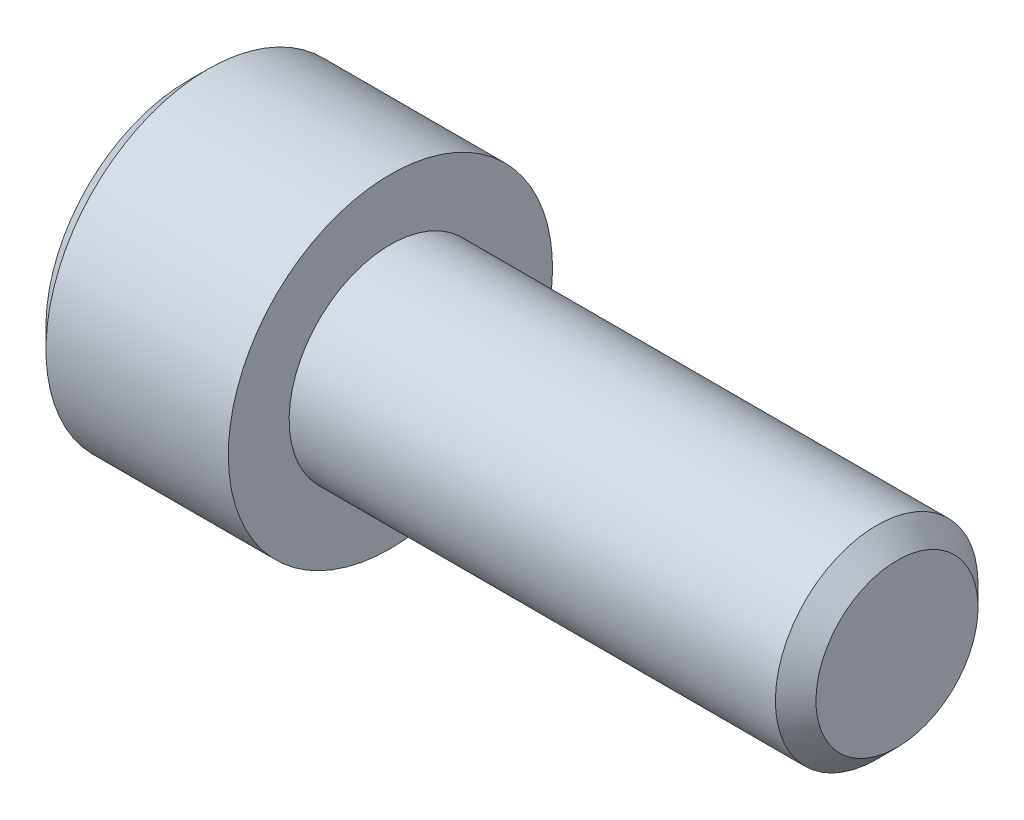
ISO-10303-21;
HEADER;
FILE_DESCRIPTION(('STEP AP214'),'2;1');
FILE_NAME('part.step','',(''),(''),'','','');
FILE_SCHEMA(('AUTOMOTIVE_DESIGN { 1 0 10303 214 1 1 1 1 }'));
ENDSEC;
DATA;
#1=APPLICATION_CONTEXT('core data for automotive mechanical design processes');
#2=APPLICATION_PROTOCOL_DEFINITION('international standard','automotive_design',2000,#1);
#3=PRODUCT_CONTEXT('',#1,'mechanical');
#4=PRODUCT('Part','Part','',(#3));
#5=PRODUCT_RELATED_PRODUCT_CATEGORY('part','',(#4));
#6=PRODUCT_DEFINITION_FORMATION('','',#4);
#7=PRODUCT_DEFINITION_CONTEXT('part definition',#1,'design');
#8=PRODUCT_DEFINITION('design','',#6,#7);
#9=PRODUCT_DEFINITION_SHAPE('','',#8);
#10=(LENGTH_UNIT() NAMED_UNIT(*) SI_UNIT(.MILLI.,.METRE.));
#11=(NAMED_UNIT(*) PLANE_ANGLE_UNIT() SI_UNIT($,.RADIAN.));
#12=(NAMED_UNIT(*) SI_UNIT($,.STERADIAN.) SOLID_ANGLE_UNIT());
#13=UNCERTAINTY_MEASURE_WITH_UNIT(LENGTH_MEASURE(1.E-05),#10,'distance_accuracy_value','');
#14=(GEOMETRIC_REPRESENTATION_CONTEXT(3) GLOBAL_UNCERTAINTY_ASSIGNED_CONTEXT((#13)) GLOBAL_UNIT_ASSIGNED_CONTEXT((#10,
#11,#12)) REPRESENTATION_CONTEXT('',''));
#15=CARTESIAN_POINT('',(0.,0.,0.));
#16=DIRECTION('',(0.,0.,1.));
#17=DIRECTION('',(1.,0.,0.));
#18=AXIS2_PLACEMENT_3D('',#15,#16,#17);
#19=CARTESIAN_POINT('',(-10.,0.,0.));
#20=DIRECTION('',(1.,0.,0.));
#21=DIRECTION('',(0.,1.,0.));
#22=AXIS2_PLACEMENT_3D('',#19,#20,#21);
#23=PLANE('',#22);
#24=CARTESIAN_POINT('',(-10.,0.,0.));
#25=DIRECTION('',(1.,0.,0.));
#26=DIRECTION('',(0.,1.,0.));
#27=AXIS2_PLACEMENT_3D('',#24,#25,#26);
#28=CIRCLE('',#27,7.);
#29=CARTESIAN_POINT('',(-10.,6.99999999999999,0.));
#30=VERTEX_POINT('',#29);
#31=EDGE_CURVE('E42',#30,#30,#28,.F.);
#32=ORIENTED_EDGE('',*,*,#31,.T.);
#33=EDGE_LOOP('',(#32));
#34=FACE_BOUND('',#33,.T.);
#35=DIRECTION('',(0.,0.5,0.866025403784439));
#36=VECTOR('',#35,1.);
#37=CARTESIAN_POINT('',(-10.,2.30940107675851,-4.));
#38=LINE('',#37,#36);
#39=CARTESIAN_POINT('',(-10.,2.30940107675851,-4.));
#40=VERTEX_POINT('',#39);
#41=CARTESIAN_POINT('',(-10.,4.61880215351701,0.));
#42=VERTEX_POINT('',#41);
#43=EDGE_CURVE('E49',#40,#42,#38,.T.);
#44=ORIENTED_EDGE('',*,*,#43,.T.);
#45=DIRECTION('',(0.,-0.5,0.866025403784438));
#46=VECTOR('',#45,1.);
#47=CARTESIAN_POINT('',(-10.,4.61880215351701,0.));
#48=LINE('',#47,#46);
#49=CARTESIAN_POINT('',(-10.,2.3094010767585,4.));
#50=VERTEX_POINT('',#49);
#51=EDGE_CURVE('E107',#42,#50,#48,.T.);
#52=ORIENTED_EDGE('',*,*,#51,.T.);
#53=DIRECTION('',(0.,-1.,0.));
#54=VECTOR('',#53,1.);
#55=CARTESIAN_POINT('',(-10.,2.3094010767585,4.));
#56=LINE('',#55,#54);
#57=CARTESIAN_POINT('',(-10.,-2.3094010767585,4.));
#58=VERTEX_POINT('',#57);
#59=EDGE_CURVE('E291',#50,#58,#56,.T.);
#60=ORIENTED_EDGE('',*,*,#59,.T.);
#61=DIRECTION('',(0.,-0.5,-0.866025403784439));
#62=VECTOR('',#61,1.);
#63=CARTESIAN_POINT('',(-10.,-2.3094010767585,4.));
#64=LINE('',#63,#62);
#65=CARTESIAN_POINT('',(-10.,-4.61880215351701,0.));
#66=VERTEX_POINT('',#65);
#67=EDGE_CURVE('E288',#58,#66,#64,.T.);
#68=ORIENTED_EDGE('',*,*,#67,.T.);
#69=DIRECTION('',(0.,0.5,-0.866025403784439));
#70=VECTOR('',#69,1.);
#71=CARTESIAN_POINT('',(-10.,-4.61880215351701,0.));
#72=LINE('',#71,#70);
#73=CARTESIAN_POINT('',(-10.,-2.3094010767585,-4.));
#74=VERTEX_POINT('',#73);
#75=EDGE_CURVE('E282',#66,#74,#72,.T.);
#76=ORIENTED_EDGE('',*,*,#75,.T.);
#77=DIRECTION('',(0.,1.,0.));
#78=VECTOR('',#77,1.);
#79=CARTESIAN_POINT('',(-10.,-2.3094010767585,-4.));
#80=LINE('',#79,#78);
#81=EDGE_CURVE('E103',#74,#40,#80,.T.);
#82=ORIENTED_EDGE('',*,*,#81,.T.);
#83=EDGE_LOOP('',(#44,#52,#60,#68,#76,#82));
#84=FACE_BOUND('',#83,.T.);
#85=ADVANCED_FACE('F34',(#34,#84),#23,.F.);
#86=CARTESIAN_POINT('',(25.,0.,0.));
#87=DIRECTION('',(-1.,0.,0.));
#88=DIRECTION('',(0.,-1.,0.));
#89=AXIS2_PLACEMENT_3D('',#86,#87,#88);
#90=CYLINDRICAL_SURFACE('',#89,8.);
#91=CARTESIAN_POINT('',(-8.99999999999998,0.,0.));
#92=DIRECTION('',(1.,0.,0.));
#93=DIRECTION('',(0.,1.,0.));
#94=AXIS2_PLACEMENT_3D('',#91,#92,#93);
#95=CIRCLE('',#94,8.);
#96=CARTESIAN_POINT('',(-8.99999999999998,7.99999999999999,0.));
#97=VERTEX_POINT('',#96);
#98=EDGE_CURVE('E11',#97,#97,#95,.T.);
#99=ORIENTED_EDGE('',*,*,#98,.T.);
#100=EDGE_LOOP('',(#99));
#101=FACE_BOUND('',#100,.T.);
#102=CARTESIAN_POINT('',(0.,0.,0.));
#103=DIRECTION('',(-1.,0.,0.));
#104=DIRECTION('',(0.,-1.,0.));
#105=AXIS2_PLACEMENT_3D('',#102,#103,#104);
#106=CIRCLE('',#105,8.);
#107=CARTESIAN_POINT('',(0.,-8.,0.));
#108=VERTEX_POINT('',#107);
#109=EDGE_CURVE('E120',#108,#108,#106,.T.);
#110=ORIENTED_EDGE('',*,*,#109,.T.);
#111=EDGE_LOOP('',(#110));
#112=FACE_BOUND('',#111,.T.);
#113=ADVANCED_FACE('F143',(#101,#112),#90,.T.);
#114=CARTESIAN_POINT('',(0.,7.99999999999999,0.));
#115=DIRECTION('',(-1.,0.,0.));
#116=DIRECTION('',(0.,-1.,0.));
#117=AXIS2_PLACEMENT_3D('',#114,#115,#116);
#118=PLANE('',#117);
#119=ORIENTED_EDGE('',*,*,#109,.F.);
#120=EDGE_LOOP('',(#119));
#121=FACE_BOUND('',#120,.T.);
#122=CARTESIAN_POINT('',(0.,0.,0.));
#123=DIRECTION('',(-1.,0.,0.));
#124=DIRECTION('',(0.,-1.,0.));
#125=AXIS2_PLACEMENT_3D('',#122,#123,#124);
#126=CIRCLE('',#125,5.);
#127=CARTESIAN_POINT('',(0.,-5.,0.));
#128=VERTEX_POINT('',#127);
#129=EDGE_CURVE('E112',#128,#128,#126,.T.);
#130=ORIENTED_EDGE('',*,*,#129,.T.);
#131=EDGE_LOOP('',(#130));
#132=FACE_BOUND('',#131,.T.);
#133=ADVANCED_FACE('F148',(#121,#132),#118,.F.);
#134=CARTESIAN_POINT('',(25.,0.,0.));
#135=DIRECTION('',(-1.,0.,0.));
#136=DIRECTION('',(0.,-1.,0.));
#137=AXIS2_PLACEMENT_3D('',#134,#135,#136);
#138=CYLINDRICAL_SURFACE('',#137,5.);
#139=CARTESIAN_POINT('',(24.,0.,0.));
#140=DIRECTION('',(-1.,0.,0.));
#141=DIRECTION('',(0.,-1.,0.));
#142=AXIS2_PLACEMENT_3D('',#139,#140,#141);
#143=CIRCLE('',#142,5.);
#144=CARTESIAN_POINT('',(24.,-5.,0.));
#145=VERTEX_POINT('',#144);
#146=EDGE_CURVE('E123',#145,#145,#143,.T.);
#147=ORIENTED_EDGE('',*,*,#146,.T.);
#148=EDGE_LOOP('',(#147));
#149=FACE_BOUND('',#148,.T.);
#150=ORIENTED_EDGE('',*,*,#129,.F.);
#151=EDGE_LOOP('',(#150));
#152=FACE_BOUND('',#151,.T.);
#153=ADVANCED_FACE('F154',(#149,#152),#138,.T.);
#154=CARTESIAN_POINT('',(25.,5.,0.));
#155=DIRECTION('',(-1.,0.,0.));
#156=DIRECTION('',(0.,-1.,0.));
#157=AXIS2_PLACEMENT_3D('',#154,#155,#156);
#158=PLANE('',#157);
#159=CARTESIAN_POINT('',(25.,0.,0.));
#160=DIRECTION('',(-1.,0.,0.));
#161=DIRECTION('',(0.,-1.,0.));
#162=AXIS2_PLACEMENT_3D('',#159,#160,#161);
#163=CIRCLE('',#162,3.99999999999999);
#164=CARTESIAN_POINT('',(25.,-3.99999999999999,0.));
#165=VERTEX_POINT('',#164);
#166=EDGE_CURVE('E126',#165,#165,#163,.F.);
#167=ORIENTED_EDGE('',*,*,#166,.T.);
#168=EDGE_LOOP('',(#167));
#169=FACE_BOUND('',#168,.T.);
#170=ADVANCED_FACE('F158',(#169),#158,.F.);
#171=CARTESIAN_POINT('',(-5.,2.30940107675851,-4.));
#172=DIRECTION('',(0.,-0.866025403784439,0.5));
#173=DIRECTION('',(0.,-0.5,-0.866025403784439));
#174=AXIS2_PLACEMENT_3D('',#171,#172,#173);
#175=PLANE('',#174);
#176=ORIENTED_EDGE('',*,*,#43,.F.);
#177=DIRECTION('',(-1.,0.,0.));
#178=VECTOR('',#177,1.);
#179=CARTESIAN_POINT('',(-5.,2.30940107675851,-4.));
#180=LINE('',#179,#178);
#181=CARTESIAN_POINT('',(-5.,2.30940107675851,-4.));
#182=VERTEX_POINT('',#181);
#183=EDGE_CURVE('E102',#182,#40,#180,.T.);
#184=ORIENTED_EDGE('',*,*,#183,.F.);
#185=DIRECTION('',(0.,0.5,0.866025403784439));
#186=VECTOR('',#185,1.);
#187=CARTESIAN_POINT('',(-5.,2.30940107675851,-4.));
#188=LINE('',#187,#186);
#189=CARTESIAN_POINT('',(-5.,4.61880215351701,0.));
#190=VERTEX_POINT('',#189);
#191=EDGE_CURVE('E93',#182,#190,#188,.T.);
#192=ORIENTED_EDGE('',*,*,#191,.T.);
#193=DIRECTION('',(-1.,0.,0.));
#194=VECTOR('',#193,1.);
#195=CARTESIAN_POINT('',(-5.,4.61880215351701,0.));
#196=LINE('',#195,#194);
#197=EDGE_CURVE('E101',#190,#42,#196,.T.);
#198=ORIENTED_EDGE('',*,*,#197,.T.);
#199=EDGE_LOOP('',(#176,#184,#192,#198));
#200=FACE_BOUND('',#199,.T.);
#201=ADVANCED_FACE('F100',(#200),#175,.T.);
#202=CARTESIAN_POINT('',(-5.,4.61880215351701,0.));
#203=DIRECTION('',(0.,-0.866025403784438,-0.5));
#204=DIRECTION('',(0.,0.5,-0.866025403784438));
#205=AXIS2_PLACEMENT_3D('',#202,#203,#204);
#206=PLANE('',#205);
#207=ORIENTED_EDGE('',*,*,#51,.F.);
#208=ORIENTED_EDGE('',*,*,#197,.F.);
#209=DIRECTION('',(0.,-0.5,0.866025403784438));
#210=VECTOR('',#209,1.);
#211=CARTESIAN_POINT('',(-5.,4.61880215351701,0.));
#212=LINE('',#211,#210);
#213=CARTESIAN_POINT('',(-5.,2.3094010767585,4.));
#214=VERTEX_POINT('',#213);
#215=EDGE_CURVE('E89',#190,#214,#212,.T.);
#216=ORIENTED_EDGE('',*,*,#215,.T.);
#217=DIRECTION('',(-1.,0.,0.));
#218=VECTOR('',#217,1.);
#219=CARTESIAN_POINT('',(-5.,2.3094010767585,4.));
#220=LINE('',#219,#218);
#221=EDGE_CURVE('E109',#214,#50,#220,.T.);
#222=ORIENTED_EDGE('',*,*,#221,.T.);
#223=EDGE_LOOP('',(#207,#208,#216,#222));
#224=FACE_BOUND('',#223,.T.);
#225=ADVANCED_FACE('F105',(#224),#206,.T.);
#226=CARTESIAN_POINT('',(-5.,2.3094010767585,4.));
#227=DIRECTION('',(0.,0.,-1.));
#228=DIRECTION('',(0.,1.,0.));
#229=AXIS2_PLACEMENT_3D('',#226,#227,#228);
#230=PLANE('',#229);
#231=ORIENTED_EDGE('',*,*,#59,.F.);
#232=ORIENTED_EDGE('',*,*,#221,.F.);
#233=DIRECTION('',(0.,-1.,0.));
#234=VECTOR('',#233,1.);
#235=CARTESIAN_POINT('',(-5.,2.3094010767585,4.));
#236=LINE('',#235,#234);
#237=CARTESIAN_POINT('',(-5.,-2.3094010767585,4.));
#238=VERTEX_POINT('',#237);
#239=EDGE_CURVE('E95',#214,#238,#236,.T.);
#240=ORIENTED_EDGE('',*,*,#239,.T.);
#241=DIRECTION('',(-1.,0.,0.));
#242=VECTOR('',#241,1.);
#243=CARTESIAN_POINT('',(-5.,-2.3094010767585,4.));
#244=LINE('',#243,#242);
#245=EDGE_CURVE('E114',#238,#58,#244,.T.);
#246=ORIENTED_EDGE('',*,*,#245,.T.);
#247=EDGE_LOOP('',(#231,#232,#240,#246));
#248=FACE_BOUND('',#247,.T.);
#249=ADVANCED_FACE('F170',(#248),#230,.T.);
#250=CARTESIAN_POINT('',(-5.,-2.3094010767585,4.));
#251=DIRECTION('',(0.,0.866025403784439,-0.5));
#252=DIRECTION('',(0.,0.5,0.866025403784439));
#253=AXIS2_PLACEMENT_3D('',#250,#251,#252);
#254=PLANE('',#253);
#255=ORIENTED_EDGE('',*,*,#67,.F.);
#256=ORIENTED_EDGE('',*,*,#245,.F.);
#257=DIRECTION('',(0.,-0.5,-0.866025403784439));
#258=VECTOR('',#257,1.);
#259=CARTESIAN_POINT('',(-5.,-2.3094010767585,4.));
#260=LINE('',#259,#258);
#261=CARTESIAN_POINT('',(-5.,-4.618802153517,0.));
#262=VERTEX_POINT('',#261);
#263=EDGE_CURVE('E307',#238,#262,#260,.T.);
#264=ORIENTED_EDGE('',*,*,#263,.T.);
#265=DIRECTION('',(-1.,0.,0.));
#266=VECTOR('',#265,1.);
#267=CARTESIAN_POINT('',(-5.,-4.618802153517,0.));
#268=LINE('',#267,#266);
#269=EDGE_CURVE('E298',#262,#66,#268,.T.);
#270=ORIENTED_EDGE('',*,*,#269,.T.);
#271=EDGE_LOOP('',(#255,#256,#264,#270));
#272=FACE_BOUND('',#271,.T.);
#273=ADVANCED_FACE('F173',(#272),#254,.T.);
#274=CARTESIAN_POINT('',(-5.,-4.618802153517,0.));
#275=DIRECTION('',(0.,0.866025403784439,0.5));
#276=DIRECTION('',(0.,-0.5,0.866025403784439));
#277=AXIS2_PLACEMENT_3D('',#274,#275,#276);
#278=PLANE('',#277);
#279=ORIENTED_EDGE('',*,*,#75,.F.);
#280=ORIENTED_EDGE('',*,*,#269,.F.);
#281=DIRECTION('',(0.,0.5,-0.866025403784439));
#282=VECTOR('',#281,1.);
#283=CARTESIAN_POINT('',(-5.,-4.618802153517,0.));
#284=LINE('',#283,#282);
#285=CARTESIAN_POINT('',(-5.,-2.3094010767585,-4.));
#286=VERTEX_POINT('',#285);
#287=EDGE_CURVE('E305',#262,#286,#284,.T.);
#288=ORIENTED_EDGE('',*,*,#287,.T.);
#289=DIRECTION('',(-1.,0.,0.));
#290=VECTOR('',#289,1.);
#291=CARTESIAN_POINT('',(-5.,-2.3094010767585,-4.));
#292=LINE('',#291,#290);
#293=EDGE_CURVE('E281',#286,#74,#292,.T.);
#294=ORIENTED_EDGE('',*,*,#293,.T.);
#295=EDGE_LOOP('',(#279,#280,#288,#294));
#296=FACE_BOUND('',#295,.T.);
#297=ADVANCED_FACE('F177',(#296),#278,.T.);
#298=CARTESIAN_POINT('',(-5.,-2.3094010767585,-4.));
#299=DIRECTION('',(0.,0.,1.));
#300=DIRECTION('',(0.,-1.,0.));
#301=AXIS2_PLACEMENT_3D('',#298,#299,#300);
#302=PLANE('',#301);
#303=ORIENTED_EDGE('',*,*,#81,.F.);
#304=ORIENTED_EDGE('',*,*,#293,.F.);
#305=DIRECTION('',(0.,1.,0.));
#306=VECTOR('',#305,1.);
#307=CARTESIAN_POINT('',(-5.,-2.3094010767585,-4.));
#308=LINE('',#307,#306);
#309=EDGE_CURVE('E296',#286,#182,#308,.T.);
#310=ORIENTED_EDGE('',*,*,#309,.T.);
#311=ORIENTED_EDGE('',*,*,#183,.T.);
#312=EDGE_LOOP('',(#303,#304,#310,#311));
#313=FACE_BOUND('',#312,.T.);
#314=ADVANCED_FACE('F181',(#313),#302,.T.);
#315=CARTESIAN_POINT('',(-5.,4.61880215351701,0.));
#316=DIRECTION('',(1.,0.,0.));
#317=DIRECTION('',(0.,0.,-1.));
#318=AXIS2_PLACEMENT_3D('',#315,#316,#317);
#319=PLANE('',#318);
#320=CARTESIAN_POINT('',(-5.,0.,0.));
#321=DIRECTION('',(1.,0.,0.));
#322=DIRECTION('',(0.,0.,-1.));
#323=AXIS2_PLACEMENT_3D('',#320,#321,#322);
#324=CIRCLE('',#323,3.995);
#325=CARTESIAN_POINT('',(-5.,0.,-3.995));
#326=VERTEX_POINT('',#325);
#327=EDGE_CURVE('E108',#326,#326,#324,.T.);
#328=ORIENTED_EDGE('',*,*,#327,.T.);
#329=EDGE_LOOP('',(#328));
#330=FACE_BOUND('',#329,.T.);
#331=ORIENTED_EDGE('',*,*,#191,.F.);
#332=ORIENTED_EDGE('',*,*,#309,.F.);
#333=ORIENTED_EDGE('',*,*,#287,.F.);
#334=ORIENTED_EDGE('',*,*,#263,.F.);
#335=ORIENTED_EDGE('',*,*,#239,.F.);
#336=ORIENTED_EDGE('',*,*,#215,.F.);
#337=EDGE_LOOP('',(#331,#332,#333,#334,#335,#336));
#338=FACE_BOUND('',#337,.T.);
#339=ADVANCED_FACE('F91',(#330,#338),#319,.F.);
#340=CARTESIAN_POINT('',(-3.92954297623768,0.,0.));
#341=DIRECTION('',(-1.,0.,0.));
#342=DIRECTION('',(0.,-1.,0.));
#343=AXIS2_PLACEMENT_3D('',#340,#341,#342);
#344=CONICAL_SURFACE('',#343,0.,1.30899693899575);
#345=ORIENTED_EDGE('',*,*,#327,.F.);
#346=EDGE_LOOP('',(#345));
#347=FACE_BOUND('',#346,.T.);
#348=CARTESIAN_POINT('',(-3.92954297623768,0.,0.));
#349=VERTEX_POINT('',#348);
#350=VERTEX_LOOP('',#349);
#351=FACE_BOUND('',#350,.T.);
#352=ADVANCED_FACE('F139',(#347,#351),#344,.F.);
#353=CARTESIAN_POINT('',(24.,0.,0.));
#354=DIRECTION('',(-1.,0.,0.));
#355=DIRECTION('',(0.,-1.,0.));
#356=AXIS2_PLACEMENT_3D('',#353,#354,#355);
#357=CONICAL_SURFACE('',#356,5.,0.785398163397451);
#358=ORIENTED_EDGE('',*,*,#166,.F.);
#359=EDGE_LOOP('',(#358));
#360=FACE_BOUND('',#359,.T.);
#361=ORIENTED_EDGE('',*,*,#146,.F.);
#362=EDGE_LOOP('',(#361));
#363=FACE_BOUND('',#362,.T.);
#364=ADVANCED_FACE('F134',(#360,#363),#357,.T.);
#365=CARTESIAN_POINT('',(-10.,0.,0.));
#366=DIRECTION('',(1.,0.,0.));
#367=DIRECTION('',(0.,1.,0.));
#368=AXIS2_PLACEMENT_3D('',#365,#366,#367);
#369=CONICAL_SURFACE('',#368,7.,0.785398163397441);
#370=ORIENTED_EDGE('',*,*,#98,.F.);
#371=EDGE_LOOP('',(#370));
#372=FACE_BOUND('',#371,.T.);
#373=ORIENTED_EDGE('',*,*,#31,.F.);
#374=EDGE_LOOP('',(#373));
#375=FACE_BOUND('',#374,.T.);
#376=ADVANCED_FACE('F36',(#372,#375),#369,.T.);
#377=CLOSED_SHELL('',(#85,#113,#133,#153,#170,#201,#225,#249,#273,#297,#314,#339,#352,#364,#376));
#378=MANIFOLD_SOLID_BREP('B2',#377);
#379=ADVANCED_BREP_SHAPE_REPRESENTATION('',(#18,#378),#14);
#380=SHAPE_DEFINITION_REPRESENTATION(#9,#379);
ENDSEC;
END-ISO-10303-21;
